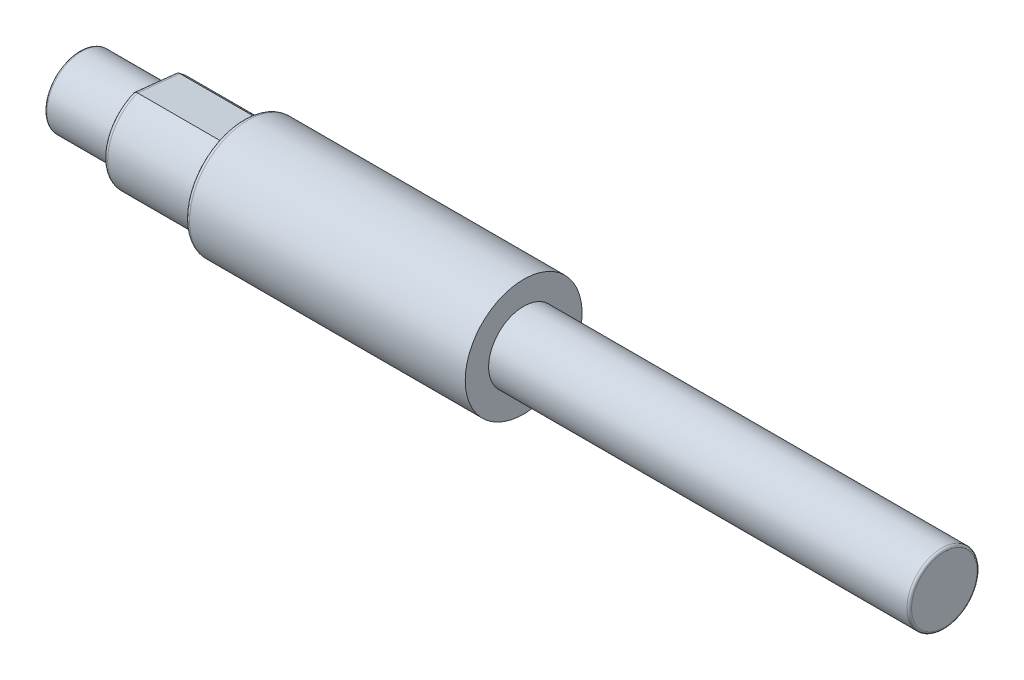
ISO-10303-21;
HEADER;
FILE_DESCRIPTION(('STEP AP214'),'2;1');
FILE_NAME('part.step','',(''),(''),'','','');
FILE_SCHEMA(('AUTOMOTIVE_DESIGN { 1 0 10303 214 1 1 1 1 }'));
ENDSEC;
DATA;
#1=APPLICATION_CONTEXT('core data for automotive mechanical design processes');
#2=APPLICATION_PROTOCOL_DEFINITION('international standard','automotive_design',2000,#1);
#3=PRODUCT_CONTEXT('',#1,'mechanical');
#4=PRODUCT('Part','Part','',(#3));
#5=PRODUCT_RELATED_PRODUCT_CATEGORY('part','',(#4));
#6=PRODUCT_DEFINITION_FORMATION('','',#4);
#7=PRODUCT_DEFINITION_CONTEXT('part definition',#1,'design');
#8=PRODUCT_DEFINITION('design','',#6,#7);
#9=PRODUCT_DEFINITION_SHAPE('','',#8);
#10=(LENGTH_UNIT() NAMED_UNIT(*) SI_UNIT(.MILLI.,.METRE.));
#11=(NAMED_UNIT(*) PLANE_ANGLE_UNIT() SI_UNIT($,.RADIAN.));
#12=(NAMED_UNIT(*) SI_UNIT($,.STERADIAN.) SOLID_ANGLE_UNIT());
#13=UNCERTAINTY_MEASURE_WITH_UNIT(LENGTH_MEASURE(1.E-05),#10,'distance_accuracy_value','');
#14=(GEOMETRIC_REPRESENTATION_CONTEXT(3) GLOBAL_UNCERTAINTY_ASSIGNED_CONTEXT((#13)) GLOBAL_UNIT_ASSIGNED_CONTEXT((#10,
#11,#12)) REPRESENTATION_CONTEXT('',''));
#15=CARTESIAN_POINT('',(0.,0.,0.));
#16=DIRECTION('',(0.,0.,1.));
#17=DIRECTION('',(1.,0.,0.));
#18=AXIS2_PLACEMENT_3D('',#15,#16,#17);
#19=CARTESIAN_POINT('',(7.,0.,0.));
#20=DIRECTION('',(-1.,0.,0.));
#21=DIRECTION('',(0.,0.,1.));
#22=AXIS2_PLACEMENT_3D('',#19,#20,#21);
#23=PLANE('',#22);
#24=CARTESIAN_POINT('',(7.,0.,0.));
#25=DIRECTION('',(-1.,0.,0.));
#26=DIRECTION('',(0.,0.,1.));
#27=AXIS2_PLACEMENT_3D('',#24,#25,#26);
#28=CIRCLE('',#27,2.3);
#29=CARTESIAN_POINT('',(7.,0.,2.3));
#30=VERTEX_POINT('',#29);
#31=EDGE_CURVE('E50',#30,#30,#28,.T.);
#32=ORIENTED_EDGE('',*,*,#31,.T.);
#33=EDGE_LOOP('',(#32));
#34=FACE_BOUND('',#33,.T.);
#35=DIRECTION('',(0.,0.104966677078623,0.994475739625192));
#36=VECTOR('',#35,1.);
#37=CARTESIAN_POINT('',(7.,1.67444549423877,-1.09372404509706));
#38=LINE('',#37,#36);
#39=CARTESIAN_POINT('',(7.,1.67444549423877,-1.09372404509706));
#40=VERTEX_POINT('',#39);
#41=CARTESIAN_POINT('',(7.,1.86588813882691,0.720042674697164));
#42=VERTEX_POINT('',#41);
#43=EDGE_CURVE('E79',#40,#42,#38,.T.);
#44=ORIENTED_EDGE('',*,*,#43,.T.);
#45=CARTESIAN_POINT('',(7.,0.,0.));
#46=DIRECTION('',(1.,0.,0.));
#47=DIRECTION('',(0.,0.,-1.));
#48=AXIS2_PLACEMENT_3D('',#45,#46,#47);
#49=CIRCLE('',#48,2.);
#50=EDGE_CURVE('E88',#42,#40,#49,.T.);
#51=ORIENTED_EDGE('',*,*,#50,.T.);
#52=EDGE_LOOP('',(#44,#51));
#53=FACE_BOUND('',#52,.T.);
#54=ADVANCED_FACE('F37',(#34,#53),#23,.T.);
#55=CARTESIAN_POINT('',(37.,0.,0.));
#56=DIRECTION('',(-1.,0.,0.));
#57=DIRECTION('',(0.,0.,1.));
#58=AXIS2_PLACEMENT_3D('',#55,#56,#57);
#59=CYLINDRICAL_SURFACE('',#58,1.5);
#60=CARTESIAN_POINT('',(36.9,0.,0.));
#61=DIRECTION('',(1.,0.,0.));
#62=DIRECTION('',(0.,0.,-1.));
#63=AXIS2_PLACEMENT_3D('',#60,#61,#62);
#64=CIRCLE('',#63,1.5);
#65=CARTESIAN_POINT('',(36.9,0.,-1.5));
#66=VERTEX_POINT('',#65);
#67=EDGE_CURVE('E111',#66,#66,#64,.F.);
#68=ORIENTED_EDGE('',*,*,#67,.T.);
#69=EDGE_LOOP('',(#68));
#70=FACE_BOUND('',#69,.T.);
#71=CARTESIAN_POINT('',(19.,0.,0.));
#72=DIRECTION('',(-1.,0.,0.));
#73=DIRECTION('',(0.,0.,1.));
#74=AXIS2_PLACEMENT_3D('',#71,#72,#73);
#75=CIRCLE('',#74,1.5);
#76=CARTESIAN_POINT('',(19.,0.,1.5));
#77=VERTEX_POINT('',#76);
#78=EDGE_CURVE('E102',#77,#77,#75,.T.);
#79=ORIENTED_EDGE('',*,*,#78,.F.);
#80=EDGE_LOOP('',(#79));
#81=FACE_BOUND('',#80,.T.);
#82=ADVANCED_FACE('F145',(#70,#81),#59,.T.);
#83=CARTESIAN_POINT('',(37.,0.,0.));
#84=DIRECTION('',(1.,0.,0.));
#85=DIRECTION('',(0.,0.,-1.));
#86=AXIS2_PLACEMENT_3D('',#83,#84,#85);
#87=PLANE('',#86);
#88=CARTESIAN_POINT('',(37.,0.,0.));
#89=DIRECTION('',(1.,0.,0.));
#90=DIRECTION('',(0.,0.,-1.));
#91=AXIS2_PLACEMENT_3D('',#88,#89,#90);
#92=CIRCLE('',#91,1.4);
#93=CARTESIAN_POINT('',(37.,0.,-1.4));
#94=VERTEX_POINT('',#93);
#95=EDGE_CURVE('E108',#94,#94,#92,.T.);
#96=ORIENTED_EDGE('',*,*,#95,.T.);
#97=EDGE_LOOP('',(#96));
#98=FACE_BOUND('',#97,.T.);
#99=ADVANCED_FACE('F151',(#98),#87,.T.);
#100=CARTESIAN_POINT('',(19.,0.,0.));
#101=DIRECTION('',(-1.,0.,0.));
#102=DIRECTION('',(0.,0.,1.));
#103=AXIS2_PLACEMENT_3D('',#100,#101,#102);
#104=CYLINDRICAL_SURFACE('',#103,2.5);
#105=CARTESIAN_POINT('',(7.2,0.,0.));
#106=DIRECTION('',(-1.,0.,0.));
#107=DIRECTION('',(0.,0.,1.));
#108=AXIS2_PLACEMENT_3D('',#105,#106,#107);
#109=CIRCLE('',#108,2.5);
#110=CARTESIAN_POINT('',(7.2,0.,2.5));
#111=VERTEX_POINT('',#110);
#112=EDGE_CURVE('E11',#111,#111,#109,.F.);
#113=ORIENTED_EDGE('',*,*,#112,.T.);
#114=EDGE_LOOP('',(#113));
#115=FACE_BOUND('',#114,.T.);
#116=CARTESIAN_POINT('',(19.,0.,0.));
#117=DIRECTION('',(-1.,0.,0.));
#118=DIRECTION('',(0.,0.,1.));
#119=AXIS2_PLACEMENT_3D('',#116,#117,#118);
#120=CIRCLE('',#119,2.5);
#121=CARTESIAN_POINT('',(19.,0.,2.5));
#122=VERTEX_POINT('',#121);
#123=EDGE_CURVE('E94',#122,#122,#120,.T.);
#124=ORIENTED_EDGE('',*,*,#123,.T.);
#125=EDGE_LOOP('',(#124));
#126=FACE_BOUND('',#125,.T.);
#127=ADVANCED_FACE('F159',(#115,#126),#104,.T.);
#128=CARTESIAN_POINT('',(19.,0.,0.));
#129=DIRECTION('',(-1.,0.,0.));
#130=DIRECTION('',(0.,0.,1.));
#131=AXIS2_PLACEMENT_3D('',#128,#129,#130);
#132=PLANE('',#131);
#133=ORIENTED_EDGE('',*,*,#78,.T.);
#134=EDGE_LOOP('',(#133));
#135=FACE_BOUND('',#134,.T.);
#136=ORIENTED_EDGE('',*,*,#123,.F.);
#137=EDGE_LOOP('',(#136));
#138=FACE_BOUND('',#137,.T.);
#139=ADVANCED_FACE('F157',(#135,#138),#132,.F.);
#140=CARTESIAN_POINT('',(3.,0.,0.));
#141=DIRECTION('',(1.,0.,0.));
#142=DIRECTION('',(0.,0.,-1.));
#143=AXIS2_PLACEMENT_3D('',#140,#141,#142);
#144=PLANE('',#143);
#145=CARTESIAN_POINT('',(3.,0.,0.));
#146=DIRECTION('',(1.,0.,0.));
#147=DIRECTION('',(0.,0.,-1.));
#148=AXIS2_PLACEMENT_3D('',#145,#146,#147);
#149=CIRCLE('',#148,1.8);
#150=CARTESIAN_POINT('',(3.,1.48075654693401,-1.0234061015609));
#151=VERTEX_POINT('',#150);
#152=CARTESIAN_POINT('',(3.,1.66178679028135,0.691711401992477));
#153=VERTEX_POINT('',#152);
#154=EDGE_CURVE('E57',#151,#153,#149,.F.);
#155=ORIENTED_EDGE('',*,*,#154,.T.);
#156=DIRECTION('',(0.,0.104966677078623,0.994475739625192));
#157=VECTOR('',#156,1.);
#158=CARTESIAN_POINT('',(3.,1.5712716686078,-0.165847349784224));
#159=LINE('',#158,#157);
#160=EDGE_CURVE('E123',#153,#151,#159,.F.);
#161=ORIENTED_EDGE('',*,*,#160,.T.);
#162=EDGE_LOOP('',(#155,#161));
#163=FACE_BOUND('',#162,.T.);
#164=CARTESIAN_POINT('',(3.,0.,0.));
#165=DIRECTION('',(1.,0.,0.));
#166=DIRECTION('',(0.,0.,-1.));
#167=AXIS2_PLACEMENT_3D('',#164,#165,#166);
#168=CIRCLE('',#167,1.5);
#169=CARTESIAN_POINT('',(3.,0.,-1.5));
#170=VERTEX_POINT('',#169);
#171=EDGE_CURVE('E105',#170,#170,#168,.T.);
#172=ORIENTED_EDGE('',*,*,#171,.T.);
#173=EDGE_LOOP('',(#172));
#174=FACE_BOUND('',#173,.T.);
#175=ADVANCED_FACE('F185',(#163,#174),#144,.F.);
#176=CARTESIAN_POINT('',(7.,0.,0.));
#177=DIRECTION('',(-1.,0.,0.));
#178=DIRECTION('',(0.,0.,1.));
#179=AXIS2_PLACEMENT_3D('',#176,#177,#178);
#180=CYLINDRICAL_SURFACE('',#179,2.);
#181=DIRECTION('',(-1.,0.,0.));
#182=VECTOR('',#181,1.);
#183=CARTESIAN_POINT('',(7.,1.86588813882691,0.720042674697164));
#184=LINE('',#183,#182);
#185=CARTESIAN_POINT('',(3.2,1.86588813882691,0.720042674697164));
#186=VERTEX_POINT('',#185);
#187=EDGE_CURVE('E85',#42,#186,#184,.T.);
#188=ORIENTED_EDGE('',*,*,#187,.T.);
#189=CARTESIAN_POINT('',(3.2,0.,0.));
#190=DIRECTION('',(1.,0.,0.));
#191=DIRECTION('',(0.,0.,-1.));
#192=AXIS2_PLACEMENT_3D('',#189,#190,#191);
#193=CIRCLE('',#192,2.);
#194=CARTESIAN_POINT('',(3.2,1.67444549423877,-1.09372404509706));
#195=VERTEX_POINT('',#194);
#196=EDGE_CURVE('E93',#186,#195,#193,.T.);
#197=ORIENTED_EDGE('',*,*,#196,.T.);
#198=DIRECTION('',(-1.,0.,0.));
#199=VECTOR('',#198,1.);
#200=CARTESIAN_POINT('',(7.,1.67444549423877,-1.09372404509706));
#201=LINE('',#200,#199);
#202=EDGE_CURVE('E83',#40,#195,#201,.T.);
#203=ORIENTED_EDGE('',*,*,#202,.F.);
#204=ORIENTED_EDGE('',*,*,#50,.F.);
#205=EDGE_LOOP('',(#188,#197,#203,#204));
#206=FACE_BOUND('',#205,.T.);
#207=ADVANCED_FACE('F91',(#206),#180,.T.);
#208=CARTESIAN_POINT('',(7.,1.67444549423877,-1.09372404509706));
#209=DIRECTION('',(0.,-0.994475739625192,0.104966677078623));
#210=DIRECTION('',(0.,-0.104966677078623,-0.994475739625192));
#211=AXIS2_PLACEMENT_3D('',#208,#209,#210);
#212=PLANE('',#211);
#213=ORIENTED_EDGE('',*,*,#202,.T.);
#214=DIRECTION('',(0.,0.104966677078623,0.994475739625192));
#215=VECTOR('',#214,1.);
#216=CARTESIAN_POINT('',(3.2,1.67444549423877,-1.09372404509706));
#217=LINE('',#216,#215);
#218=EDGE_CURVE('E120',#195,#186,#217,.T.);
#219=ORIENTED_EDGE('',*,*,#218,.T.);
#220=ORIENTED_EDGE('',*,*,#187,.F.);
#221=ORIENTED_EDGE('',*,*,#43,.F.);
#222=EDGE_LOOP('',(#213,#219,#220,#221));
#223=FACE_BOUND('',#222,.T.);
#224=ADVANCED_FACE('F81',(#223),#212,.F.);
#225=CARTESIAN_POINT('',(0.,0.,0.));
#226=DIRECTION('',(1.,0.,0.));
#227=DIRECTION('',(0.,0.,-1.));
#228=AXIS2_PLACEMENT_3D('',#225,#226,#227);
#229=PLANE('',#228);
#230=CARTESIAN_POINT('',(0.,0.,0.));
#231=DIRECTION('',(1.,0.,0.));
#232=DIRECTION('',(0.,0.,-1.));
#233=AXIS2_PLACEMENT_3D('',#230,#231,#232);
#234=CIRCLE('',#233,1.4);
#235=CARTESIAN_POINT('',(0.,0.,-1.4));
#236=VERTEX_POINT('',#235);
#237=EDGE_CURVE('E117',#236,#236,#234,.F.);
#238=ORIENTED_EDGE('',*,*,#237,.T.);
#239=EDGE_LOOP('',(#238));
#240=FACE_BOUND('',#239,.T.);
#241=ADVANCED_FACE('F166',(#240),#229,.F.);
#242=CARTESIAN_POINT('',(0.100000000000003,0.,0.));
#243=DIRECTION('',(1.,0.,0.));
#244=DIRECTION('',(0.,0.,-1.));
#245=AXIS2_PLACEMENT_3D('',#242,#243,#244);
#246=CIRCLE('',#245,1.5);
#247=CARTESIAN_POINT('',(0.100000000000003,0.,-1.5));
#248=VERTEX_POINT('',#247);
#249=EDGE_CURVE('E114',#248,#248,#246,.T.);
#250=ORIENTED_EDGE('',*,*,#249,.T.);
#251=EDGE_LOOP('',(#250));
#252=FACE_BOUND('',#251,.T.);
#253=ORIENTED_EDGE('',*,*,#171,.F.);
#254=EDGE_LOOP('',(#253));
#255=FACE_BOUND('',#254,.T.);
#256=ADVANCED_FACE('F154',(#252,#255),#59,.T.);
#257=CARTESIAN_POINT('',(36.9,0.,0.));
#258=DIRECTION('',(1.,0.,0.));
#259=DIRECTION('',(0.,0.,-1.));
#260=AXIS2_PLACEMENT_3D('',#257,#258,#259);
#261=TOROIDAL_SURFACE('',#260,1.4,0.1);
#262=ORIENTED_EDGE('',*,*,#67,.F.);
#263=EDGE_LOOP('',(#262));
#264=FACE_BOUND('',#263,.T.);
#265=ORIENTED_EDGE('',*,*,#95,.F.);
#266=EDGE_LOOP('',(#265));
#267=FACE_BOUND('',#266,.T.);
#268=ADVANCED_FACE('F171',(#264,#267),#261,.T.);
#269=CARTESIAN_POINT('',(0.100000000000003,0.,0.));
#270=DIRECTION('',(1.,0.,0.));
#271=DIRECTION('',(0.,0.,-1.));
#272=AXIS2_PLACEMENT_3D('',#269,#270,#271);
#273=TOROIDAL_SURFACE('',#272,1.4,0.1);
#274=ORIENTED_EDGE('',*,*,#237,.F.);
#275=EDGE_LOOP('',(#274));
#276=FACE_BOUND('',#275,.T.);
#277=ORIENTED_EDGE('',*,*,#249,.F.);
#278=EDGE_LOOP('',(#277));
#279=FACE_BOUND('',#278,.T.);
#280=ADVANCED_FACE('F142',(#276,#279),#273,.T.);
#281=CARTESIAN_POINT('',(3.2,0.,0.));
#282=DIRECTION('',(1.,0.,0.));
#283=DIRECTION('',(0.,0.,-1.));
#284=AXIS2_PLACEMENT_3D('',#281,#282,#283);
#285=TOROIDAL_SURFACE('',#284,1.8,0.2);
#286=CARTESIAN_POINT('',(3.2,1.86588813882691,0.720042674697164));
#287=CARTESIAN_POINT('',(3.18897885360839,1.86589887159593,0.720043784407632));
#288=CARTESIAN_POINT('',(3.17796232193086,1.86495980340107,0.719919823717802));
#289=CARTESIAN_POINT('',(3.15626030764268,1.86126322340372,0.71943020225701));
#290=CARTESIAN_POINT('',(3.14557435886794,1.85850840704232,0.719064899751167));
#291=CARTESIAN_POINT('',(3.12481862557765,1.85126026774464,0.718100885922635));
#292=CARTESIAN_POINT('',(3.11474897504427,1.84676656832207,0.717502124053349));
#293=CARTESIAN_POINT('',(3.09550230496301,1.83618791187575,0.716086575157864));
#294=CARTESIAN_POINT('',(3.08632526592376,1.83010298960919,0.715269792893892));
#295=CARTESIAN_POINT('',(3.0690016265257,1.81644838289993,0.713427315756953));
#296=CARTESIAN_POINT('',(3.06086821461073,1.80886229347063,0.712399307328656));
#297=CARTESIAN_POINT('',(3.04595950635072,1.79247559698753,0.710164907179169));
#298=CARTESIAN_POINT('',(3.03918470411198,1.78367455002922,0.708958450835275));
#299=CARTESIAN_POINT('',(3.02699426922044,1.76486145430953,0.70636159179846));
#300=CARTESIAN_POINT('',(3.02161980975451,1.7548233228798,0.704967134082857));
#301=CARTESIAN_POINT('',(3.01259954154486,1.73401843114211,0.702054545171841));
#302=CARTESIAN_POINT('',(3.00895291686117,1.72325201750329,0.700536472749023));
#303=CARTESIAN_POINT('',(3.00430775579383,1.70467026589631,0.697895105083519));
#304=CARTESIAN_POINT('',(3.00283979785536,1.696965011774,0.696793886848642));
#305=CARTESIAN_POINT('',(3.00078203627245,1.68145058998706,0.694563947119842));
#306=CARTESIAN_POINT('',(3.00019081734864,1.67364161037094,0.69343527294752));
#307=CARTESIAN_POINT('',(3.00001303796498,1.66448266345392,0.692103871989432));
#308=CARTESIAN_POINT('',(2.99999996550419,1.66313461218865,0.691907717743164));
#309=CARTESIAN_POINT('',(3.,1.66178679028145,0.691711401992239));
#310=B_SPLINE_CURVE_WITH_KNOTS('',3,(#286,#287,#288,#289,#290,#291,#292,#293,#294,#295,#296,
#297,#298,#299,#300,#301,#302,#303,#304,#305,#306,#307,#308,#309),.UNSPECIFIED.,.F.,.F.,(4,2,2,
2,2,2,2,2,2,2,2,4),(0.,0.0330158631898572,0.0659828250571094,0.0989569286123154,
0.131930311972122,0.165286199647246,0.198654196453842,0.232914159277433,0.267157927264206,
0.290876329577299,0.314556402530569,0.318643042601113),.UNSPECIFIED.);
#311=EDGE_CURVE('E97',#153,#186,#310,.F.);
#312=ORIENTED_EDGE('',*,*,#311,.F.);
#313=ORIENTED_EDGE('',*,*,#154,.F.);
#314=CARTESIAN_POINT('',(3.2,1.67444549423877,-1.09372404509706));
#315=CARTESIAN_POINT('',(3.18897885360839,1.67445575882214,-1.09372737107306));
#316=CARTESIAN_POINT('',(3.17796232193086,1.67356326366312,-1.09341008930816));
#317=CARTESIAN_POINT('',(3.15626030764268,1.67005036157551,-1.09215950873317));
#318=CARTESIAN_POINT('',(3.14557435886794,1.66743251589494,-1.09122712303049));
#319=CARTESIAN_POINT('',(3.12481862557765,1.66054535730671,-1.08877113188217));
#320=CARTESIAN_POINT('',(3.11474897504427,1.65627568676179,-1.08724739840337));
#321=CARTESIAN_POINT('',(3.09550230496301,1.6462256709367,-1.08365449807075));
#322=CARTESIAN_POINT('',(3.08632526592376,1.64044535865357,-1.08158534313058));
#323=CARTESIAN_POINT('',(3.0690016265257,1.62747630558354,-1.07693274505519));
#324=CARTESIAN_POINT('',(3.06086821461073,1.62027200431975,-1.07434361441759));
#325=CARTESIAN_POINT('',(3.04595950635072,1.60471288901323,-1.06873734145459));
#326=CARTESIAN_POINT('',(3.03918470411198,1.59635765825124,-1.06572004409006));
#327=CARTESIAN_POINT('',(3.02699426922044,1.57850128371448,-1.05925273121543));
#328=CARTESIAN_POINT('',(3.02161980975451,1.56897547861101,-1.05579330466585));
#329=CARTESIAN_POINT('',(3.01259954154486,1.54923711535764,-1.04860138486239));
#330=CARTESIAN_POINT('',(3.00895291686117,1.5390248839675,-1.04486902146136));
#331=CARTESIAN_POINT('',(3.00430775579383,1.52140404787093,-1.03840647930012));
#332=CARTESIAN_POINT('',(3.00283979785536,1.514098492105,-1.03572087366247));
#333=CARTESIAN_POINT('',(3.00078203627245,1.49939149882547,-1.03030107078292));
#334=CARTESIAN_POINT('',(3.00019081734864,1.49199023533705,-1.02756695907942));
#335=CARTESIAN_POINT('',(3.00001303796498,1.48331107644256,-1.02435275030833));
#336=CARTESIAN_POINT('',(2.99999996550419,1.48203368267744,-1.02387948096542));
#337=CARTESIAN_POINT('',(3.,1.48075654693415,-1.02340610156069));
#338=B_SPLINE_CURVE_WITH_KNOTS('',3,(#314,#315,#316,#317,#318,#319,#320,#321,#322,#323,#324,
#325,#326,#327,#328,#329,#330,#331,#332,#333,#334,#335,#336,#337),.UNSPECIFIED.,.F.,.F.,(4,2,2,
2,2,2,2,2,2,2,2,4),(0.,0.0330158631898572,0.0659828250571094,0.0989569286123154,
0.131930311972122,0.165286199647246,0.198654196453843,0.232914159277432,0.267157927264205,
0.290876329577299,0.314556402530569,0.318643042601112),.UNSPECIFIED.);
#339=EDGE_CURVE('E41',#195,#151,#338,.T.);
#340=ORIENTED_EDGE('',*,*,#339,.F.);
#341=ORIENTED_EDGE('',*,*,#196,.F.);
#342=EDGE_LOOP('',(#312,#313,#340,#341));
#343=FACE_BOUND('',#342,.T.);
#344=ADVANCED_FACE('F130',(#343),#285,.T.);
#345=CARTESIAN_POINT('',(3.2,1.47555034631373,-1.07273070968134));
#346=DIRECTION('',(0.,0.104966677078623,0.994475739625192));
#347=DIRECTION('',(0.,-0.994475739625192,0.104966677078623));
#348=AXIS2_PLACEMENT_3D('',#345,#346,#347);
#349=CYLINDRICAL_SURFACE('',#348,0.2);
#350=ORIENTED_EDGE('',*,*,#339,.T.);
#351=ORIENTED_EDGE('',*,*,#160,.F.);
#352=ORIENTED_EDGE('',*,*,#311,.T.);
#353=ORIENTED_EDGE('',*,*,#218,.F.);
#354=EDGE_LOOP('',(#350,#351,#352,#353));
#355=FACE_BOUND('',#354,.T.);
#356=ADVANCED_FACE('F133',(#355),#349,.T.);
#357=CARTESIAN_POINT('',(7.2,0.,0.));
#358=DIRECTION('',(-1.,0.,0.));
#359=DIRECTION('',(0.,0.,1.));
#360=AXIS2_PLACEMENT_3D('',#357,#358,#359);
#361=TOROIDAL_SURFACE('',#360,2.3,0.2);
#362=ORIENTED_EDGE('',*,*,#112,.F.);
#363=EDGE_LOOP('',(#362));
#364=FACE_BOUND('',#363,.T.);
#365=ORIENTED_EDGE('',*,*,#31,.F.);
#366=EDGE_LOOP('',(#365));
#367=FACE_BOUND('',#366,.T.);
#368=ADVANCED_FACE('F39',(#364,#367),#361,.T.);
#369=CLOSED_SHELL('',(#54,#82,#99,#127,#139,#175,#207,#224,#241,#256,#268,#280,#344,#356,#368));
#370=MANIFOLD_SOLID_BREP('B2',#369);
#371=ADVANCED_BREP_SHAPE_REPRESENTATION('',(#18,#370),#14);
#372=SHAPE_DEFINITION_REPRESENTATION(#9,#371);
ENDSEC;
END-ISO-10303-21;
